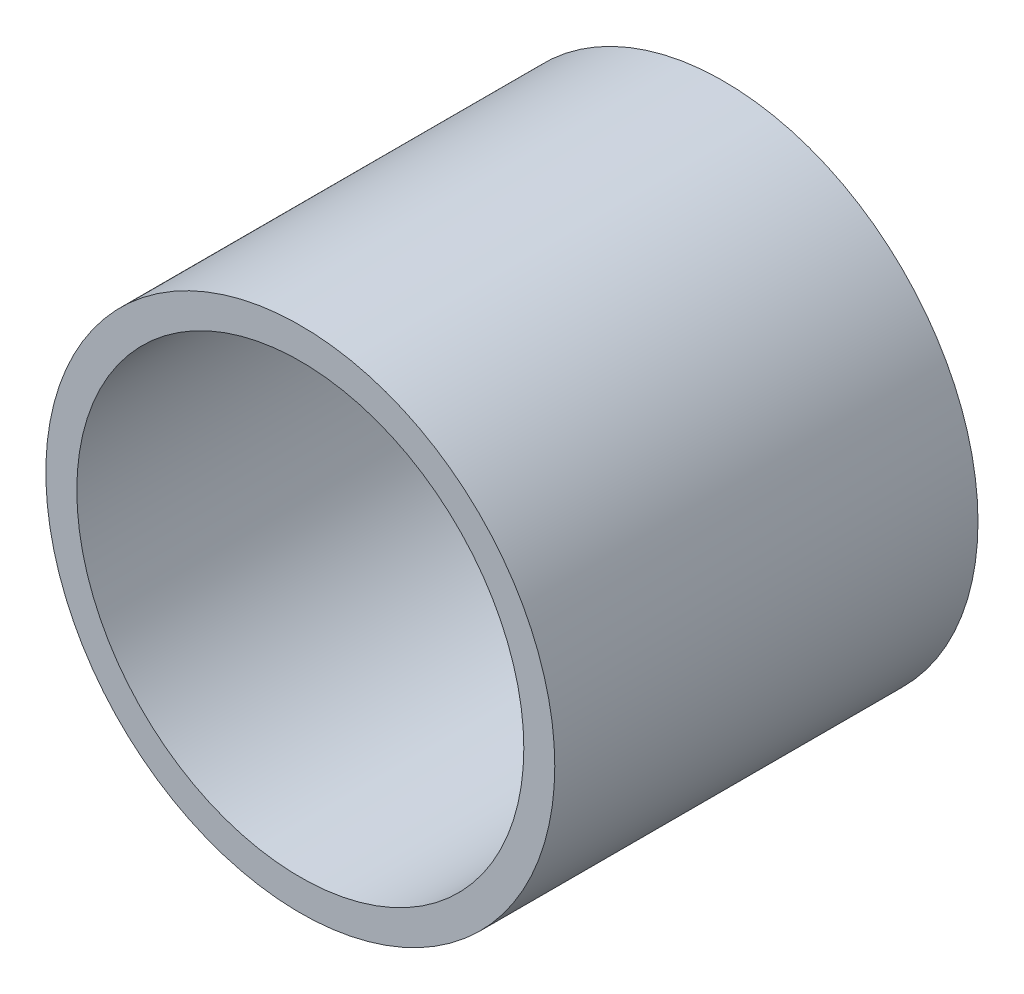
ISO-10303-21;
HEADER;
FILE_DESCRIPTION(('STEP AP214'),'2;1');
FILE_NAME('part.step','',(''),(''),'','','');
FILE_SCHEMA(('AUTOMOTIVE_DESIGN { 1 0 10303 214 1 1 1 1 }'));
ENDSEC;
DATA;
#1=APPLICATION_CONTEXT('core data for automotive mechanical design processes');
#2=APPLICATION_PROTOCOL_DEFINITION('international standard','automotive_design',2000,#1);
#3=PRODUCT_CONTEXT('',#1,'mechanical');
#4=PRODUCT('Part','Part','',(#3));
#5=PRODUCT_RELATED_PRODUCT_CATEGORY('part','',(#4));
#6=PRODUCT_DEFINITION_FORMATION('','',#4);
#7=PRODUCT_DEFINITION_CONTEXT('part definition',#1,'design');
#8=PRODUCT_DEFINITION('design','',#6,#7);
#9=PRODUCT_DEFINITION_SHAPE('','',#8);
#10=(LENGTH_UNIT() NAMED_UNIT(*) SI_UNIT(.MILLI.,.METRE.));
#11=(NAMED_UNIT(*) PLANE_ANGLE_UNIT() SI_UNIT($,.RADIAN.));
#12=(NAMED_UNIT(*) SI_UNIT($,.STERADIAN.) SOLID_ANGLE_UNIT());
#13=UNCERTAINTY_MEASURE_WITH_UNIT(LENGTH_MEASURE(1.E-05),#10,'distance_accuracy_value','');
#14=(GEOMETRIC_REPRESENTATION_CONTEXT(3) GLOBAL_UNCERTAINTY_ASSIGNED_CONTEXT((#13)) GLOBAL_UNIT_ASSIGNED_CONTEXT((#10,
#11,#12)) REPRESENTATION_CONTEXT('',''));
#15=CARTESIAN_POINT('',(0.,0.,0.));
#16=DIRECTION('',(0.,0.,1.));
#17=DIRECTION('',(1.,0.,0.));
#18=AXIS2_PLACEMENT_3D('',#15,#16,#17);
#19=CARTESIAN_POINT('',(0.,0.,10.414));
#20=DIRECTION('',(0.,0.,1.));
#21=DIRECTION('',(1.,0.,0.));
#22=AXIS2_PLACEMENT_3D('',#19,#20,#21);
#23=PLANE('',#22);
#24=CARTESIAN_POINT('',(0.,0.,10.414));
#25=DIRECTION('',(0.,0.,1.));
#26=DIRECTION('',(1.,0.,0.));
#27=AXIS2_PLACEMENT_3D('',#24,#25,#26);
#28=CIRCLE('',#27,6.262000049);
#29=CARTESIAN_POINT('',(6.262000049,0.,10.414));
#30=VERTEX_POINT('',#29);
#31=EDGE_CURVE('E10',#30,#30,#28,.T.);
#32=ORIENTED_EDGE('',*,*,#31,.T.);
#33=EDGE_LOOP('',(#32));
#34=FACE_BOUND('',#33,.T.);
#35=CARTESIAN_POINT('',(0.,0.,10.414));
#36=DIRECTION('',(0.,0.,1.));
#37=DIRECTION('',(1.,0.,0.));
#38=AXIS2_PLACEMENT_3D('',#35,#36,#37);
#39=CIRCLE('',#38,5.5);
#40=CARTESIAN_POINT('',(5.5,0.,10.414));
#41=VERTEX_POINT('',#40);
#42=EDGE_CURVE('E50',#41,#41,#39,.T.);
#43=ORIENTED_EDGE('',*,*,#42,.F.);
#44=EDGE_LOOP('',(#43));
#45=FACE_BOUND('',#44,.T.);
#46=ADVANCED_FACE('F39',(#34,#45),#23,.T.);
#47=CARTESIAN_POINT('',(0.,0.,0.));
#48=DIRECTION('',(0.,0.,1.));
#49=DIRECTION('',(1.,0.,0.));
#50=AXIS2_PLACEMENT_3D('',#47,#48,#49);
#51=PLANE('',#50);
#52=CARTESIAN_POINT('',(0.,0.,0.));
#53=DIRECTION('',(0.,0.,1.));
#54=DIRECTION('',(1.,0.,0.));
#55=AXIS2_PLACEMENT_3D('',#52,#53,#54);
#56=CIRCLE('',#55,6.262000049);
#57=CARTESIAN_POINT('',(6.262000049,0.,0.));
#58=VERTEX_POINT('',#57);
#59=EDGE_CURVE('E43',#58,#58,#56,.T.);
#60=ORIENTED_EDGE('',*,*,#59,.F.);
#61=EDGE_LOOP('',(#60));
#62=FACE_BOUND('',#61,.T.);
#63=CARTESIAN_POINT('',(0.,0.,0.));
#64=DIRECTION('',(0.,0.,1.));
#65=DIRECTION('',(1.,0.,0.));
#66=AXIS2_PLACEMENT_3D('',#63,#64,#65);
#67=CIRCLE('',#66,5.5);
#68=CARTESIAN_POINT('',(5.5,0.,0.));
#69=VERTEX_POINT('',#68);
#70=EDGE_CURVE('E52',#69,#69,#67,.T.);
#71=ORIENTED_EDGE('',*,*,#70,.T.);
#72=EDGE_LOOP('',(#71));
#73=FACE_BOUND('',#72,.T.);
#74=ADVANCED_FACE('F62',(#62,#73),#51,.F.);
#75=CARTESIAN_POINT('',(0.,0.,10.414));
#76=DIRECTION('',(0.,0.,-1.));
#77=DIRECTION('',(-1.,0.,0.));
#78=AXIS2_PLACEMENT_3D('',#75,#76,#77);
#79=CYLINDRICAL_SURFACE('',#78,6.262000049);
#80=ORIENTED_EDGE('',*,*,#31,.F.);
#81=EDGE_LOOP('',(#80));
#82=FACE_BOUND('',#81,.T.);
#83=ORIENTED_EDGE('',*,*,#59,.T.);
#84=EDGE_LOOP('',(#83));
#85=FACE_BOUND('',#84,.T.);
#86=ADVANCED_FACE('F41',(#82,#85),#79,.T.);
#87=CARTESIAN_POINT('',(0.,0.,10.414));
#88=DIRECTION('',(0.,0.,-1.));
#89=DIRECTION('',(-1.,0.,0.));
#90=AXIS2_PLACEMENT_3D('',#87,#88,#89);
#91=CYLINDRICAL_SURFACE('',#90,5.5);
#92=ORIENTED_EDGE('',*,*,#42,.T.);
#93=EDGE_LOOP('',(#92));
#94=FACE_BOUND('',#93,.T.);
#95=ORIENTED_EDGE('',*,*,#70,.F.);
#96=EDGE_LOOP('',(#95));
#97=FACE_BOUND('',#96,.T.);
#98=ADVANCED_FACE('F58',(#94,#97),#91,.F.);
#99=CLOSED_SHELL('',(#46,#74,#86,#98));
#100=MANIFOLD_SOLID_BREP('B2',#99);
#101=ADVANCED_BREP_SHAPE_REPRESENTATION('',(#18,#100),#14);
#102=SHAPE_DEFINITION_REPRESENTATION(#9,#101);
ENDSEC;
END-ISO-10303-21;
